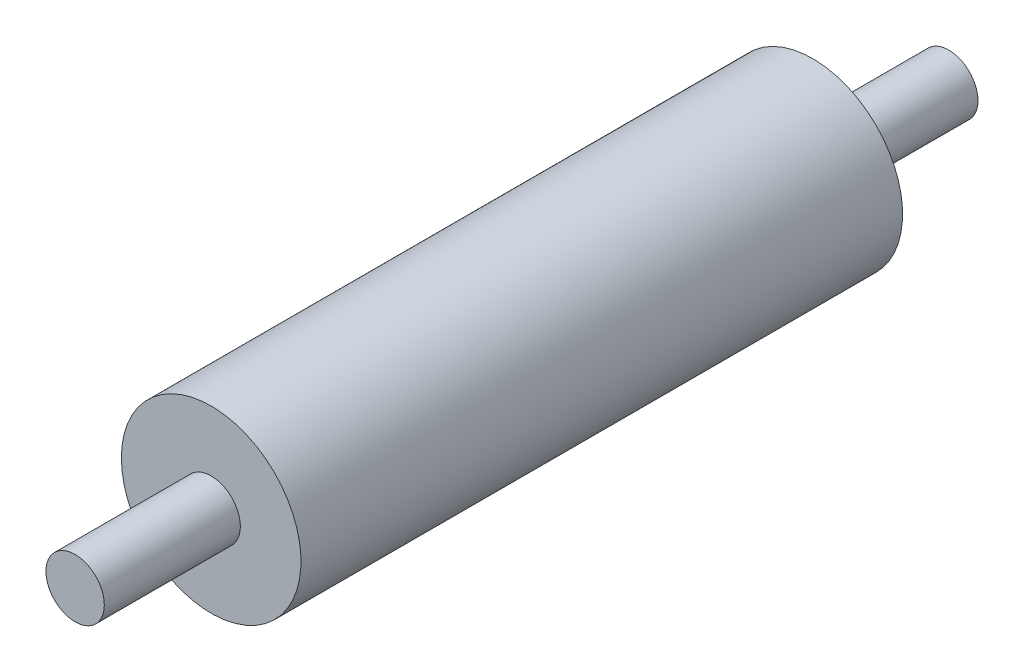
ISO-10303-21;
HEADER;
FILE_DESCRIPTION(('STEP AP214'),'2;1');
FILE_NAME('part.step','',(''),(''),'','','');
FILE_SCHEMA(('AUTOMOTIVE_DESIGN { 1 0 10303 214 1 1 1 1 }'));
ENDSEC;
DATA;
#1=APPLICATION_CONTEXT('core data for automotive mechanical design processes');
#2=APPLICATION_PROTOCOL_DEFINITION('international standard','automotive_design',2000,#1);
#3=PRODUCT_CONTEXT('',#1,'mechanical');
#4=PRODUCT('Part','Part','',(#3));
#5=PRODUCT_RELATED_PRODUCT_CATEGORY('part','',(#4));
#6=PRODUCT_DEFINITION_FORMATION('','',#4);
#7=PRODUCT_DEFINITION_CONTEXT('part definition',#1,'design');
#8=PRODUCT_DEFINITION('design','',#6,#7);
#9=PRODUCT_DEFINITION_SHAPE('','',#8);
#10=(LENGTH_UNIT() NAMED_UNIT(*) SI_UNIT(.MILLI.,.METRE.));
#11=(NAMED_UNIT(*) PLANE_ANGLE_UNIT() SI_UNIT($,.RADIAN.));
#12=(NAMED_UNIT(*) SI_UNIT($,.STERADIAN.) SOLID_ANGLE_UNIT());
#13=UNCERTAINTY_MEASURE_WITH_UNIT(LENGTH_MEASURE(1.E-05),#10,'distance_accuracy_value','');
#14=(GEOMETRIC_REPRESENTATION_CONTEXT(3) GLOBAL_UNCERTAINTY_ASSIGNED_CONTEXT((#13)) GLOBAL_UNIT_ASSIGNED_CONTEXT((#10,
#11,#12)) REPRESENTATION_CONTEXT('',''));
#15=CARTESIAN_POINT('',(0.,0.,0.));
#16=DIRECTION('',(0.,0.,1.));
#17=DIRECTION('',(1.,0.,0.));
#18=AXIS2_PLACEMENT_3D('',#15,#16,#17);
#19=CARTESIAN_POINT('',(-26.75,13.8,36.3507611844575));
#20=DIRECTION('',(0.,0.,1.));
#21=DIRECTION('',(1.,0.,0.));
#22=AXIS2_PLACEMENT_3D('',#19,#20,#21);
#23=CYLINDRICAL_SURFACE('',#22,0.324999999999998);
#24=CARTESIAN_POINT('',(-26.75,13.8,38.785));
#25=DIRECTION('',(0.,0.,-1.));
#26=DIRECTION('',(-1.,0.,0.));
#27=AXIS2_PLACEMENT_3D('',#24,#25,#26);
#28=CIRCLE('',#27,0.324999999999998);
#29=CARTESIAN_POINT('',(-27.075,13.8,38.785));
#30=VERTEX_POINT('',#29);
#31=EDGE_CURVE('E10',#30,#30,#28,.F.);
#32=ORIENTED_EDGE('',*,*,#31,.F.);
#33=EDGE_LOOP('',(#32));
#34=FACE_BOUND('',#33,.T.);
#35=CARTESIAN_POINT('',(-26.75,13.8,37.27));
#36=DIRECTION('',(0.,0.,1.));
#37=DIRECTION('',(1.,0.,0.));
#38=AXIS2_PLACEMENT_3D('',#35,#36,#37);
#39=CIRCLE('',#38,0.324999999999998);
#40=CARTESIAN_POINT('',(-26.425,13.8,37.27));
#41=VERTEX_POINT('',#40);
#42=EDGE_CURVE('E43',#41,#41,#39,.F.);
#43=ORIENTED_EDGE('',*,*,#42,.F.);
#44=EDGE_LOOP('',(#43));
#45=FACE_BOUND('',#44,.T.);
#46=ADVANCED_FACE('F37',(#34,#45),#23,.T.);
#47=CARTESIAN_POINT('',(-25.75,12.8,37.27));
#48=DIRECTION('',(0.,0.,1.));
#49=DIRECTION('',(1.,0.,0.));
#50=AXIS2_PLACEMENT_3D('',#47,#48,#49);
#51=PLANE('',#50);
#52=ORIENTED_EDGE('',*,*,#42,.T.);
#53=EDGE_LOOP('',(#52));
#54=FACE_BOUND('',#53,.T.);
#55=ADVANCED_FACE('F85',(#54),#51,.F.);
#56=CARTESIAN_POINT('',(-26.75,13.8,38.785));
#57=DIRECTION('',(0.,0.,1.));
#58=DIRECTION('',(1.,0.,0.));
#59=AXIS2_PLACEMENT_3D('',#56,#57,#58);
#60=CYLINDRICAL_SURFACE('',#59,1.);
#61=CARTESIAN_POINT('',(-26.75,13.8,38.785));
#62=DIRECTION('',(0.,0.,-1.));
#63=DIRECTION('',(-1.,0.,0.));
#64=AXIS2_PLACEMENT_3D('',#61,#62,#63);
#65=CIRCLE('',#64,1.);
#66=CARTESIAN_POINT('',(-27.75,13.8,38.785));
#67=VERTEX_POINT('',#66);
#68=EDGE_CURVE('E56',#67,#67,#65,.T.);
#69=ORIENTED_EDGE('',*,*,#68,.F.);
#70=EDGE_LOOP('',(#69));
#71=FACE_BOUND('',#70,.T.);
#72=CARTESIAN_POINT('',(-26.75,13.8,45.485));
#73=DIRECTION('',(0.,0.,-1.));
#74=DIRECTION('',(-1.,0.,0.));
#75=AXIS2_PLACEMENT_3D('',#72,#73,#74);
#76=CIRCLE('',#75,1.);
#77=CARTESIAN_POINT('',(-27.75,13.8,45.485));
#78=VERTEX_POINT('',#77);
#79=EDGE_CURVE('E60',#78,#78,#76,.T.);
#80=ORIENTED_EDGE('',*,*,#79,.T.);
#81=EDGE_LOOP('',(#80));
#82=FACE_BOUND('',#81,.T.);
#83=ADVANCED_FACE('F67',(#71,#82),#60,.T.);
#84=CARTESIAN_POINT('',(-26.75,13.8,38.785));
#85=DIRECTION('',(0.,0.,-1.));
#86=DIRECTION('',(-1.,0.,0.));
#87=AXIS2_PLACEMENT_3D('',#84,#85,#86);
#88=PLANE('',#87);
#89=ORIENTED_EDGE('',*,*,#31,.T.);
#90=EDGE_LOOP('',(#89));
#91=FACE_BOUND('',#90,.T.);
#92=ORIENTED_EDGE('',*,*,#68,.T.);
#93=EDGE_LOOP('',(#92));
#94=FACE_BOUND('',#93,.T.);
#95=ADVANCED_FACE('F72',(#91,#94),#88,.T.);
#96=CARTESIAN_POINT('',(-26.75,13.8,45.485));
#97=DIRECTION('',(0.,0.,-1.));
#98=DIRECTION('',(-1.,0.,0.));
#99=AXIS2_PLACEMENT_3D('',#96,#97,#98);
#100=PLANE('',#99);
#101=CARTESIAN_POINT('',(-26.75,13.8,45.485));
#102=DIRECTION('',(0.,0.,-1.));
#103=DIRECTION('',(-1.,0.,0.));
#104=AXIS2_PLACEMENT_3D('',#101,#102,#103);
#105=CIRCLE('',#104,0.324999999999998);
#106=CARTESIAN_POINT('',(-27.075,13.8,45.485));
#107=VERTEX_POINT('',#106);
#108=EDGE_CURVE('E52',#107,#107,#105,.F.);
#109=ORIENTED_EDGE('',*,*,#108,.F.);
#110=EDGE_LOOP('',(#109));
#111=FACE_BOUND('',#110,.T.);
#112=ORIENTED_EDGE('',*,*,#79,.F.);
#113=EDGE_LOOP('',(#112));
#114=FACE_BOUND('',#113,.T.);
#115=ADVANCED_FACE('F69',(#111,#114),#100,.F.);
#116=CARTESIAN_POINT('',(-26.75,13.8,47.));
#117=DIRECTION('',(0.,0.,1.));
#118=DIRECTION('',(1.,0.,0.));
#119=AXIS2_PLACEMENT_3D('',#116,#117,#118);
#120=PLANE('',#119);
#121=CARTESIAN_POINT('',(-26.75,13.8,47.));
#122=DIRECTION('',(0.,0.,1.));
#123=DIRECTION('',(1.,0.,0.));
#124=AXIS2_PLACEMENT_3D('',#121,#122,#123);
#125=CIRCLE('',#124,0.324999999999998);
#126=CARTESIAN_POINT('',(-26.425,13.8,47.));
#127=VERTEX_POINT('',#126);
#128=EDGE_CURVE('E47',#127,#127,#125,.T.);
#129=ORIENTED_EDGE('',*,*,#128,.T.);
#130=EDGE_LOOP('',(#129));
#131=FACE_BOUND('',#130,.T.);
#132=ADVANCED_FACE('F71',(#131),#120,.T.);
#133=ORIENTED_EDGE('',*,*,#128,.F.);
#134=EDGE_LOOP('',(#133));
#135=FACE_BOUND('',#134,.T.);
#136=ORIENTED_EDGE('',*,*,#108,.T.);
#137=EDGE_LOOP('',(#136));
#138=FACE_BOUND('',#137,.T.);
#139=ADVANCED_FACE('F80',(#135,#138),#23,.T.);
#140=CLOSED_SHELL('',(#46,#55,#83,#95,#115,#132,#139));
#141=MANIFOLD_SOLID_BREP('B2',#140);
#142=ADVANCED_BREP_SHAPE_REPRESENTATION('',(#18,#141),#14);
#143=SHAPE_DEFINITION_REPRESENTATION(#9,#142);
ENDSEC;
END-ISO-10303-21;
